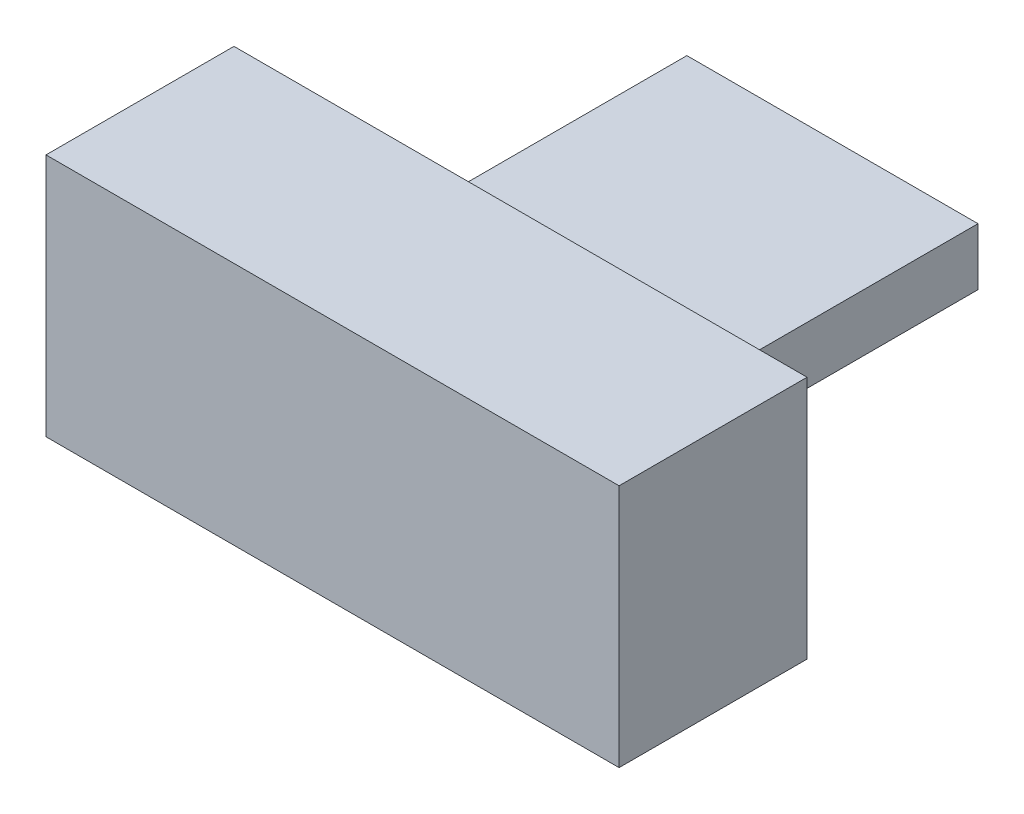
ISO-10303-21;
HEADER;
FILE_DESCRIPTION(('STEP AP214'),'2;1');
FILE_NAME('part.step','',(''),(''),'','','');
FILE_SCHEMA(('AUTOMOTIVE_DESIGN { 1 0 10303 214 1 1 1 1 }'));
ENDSEC;
DATA;
#1=APPLICATION_CONTEXT('core data for automotive mechanical design processes');
#2=APPLICATION_PROTOCOL_DEFINITION('international standard','automotive_design',2000,#1);
#3=PRODUCT_CONTEXT('',#1,'mechanical');
#4=PRODUCT('Part','Part','',(#3));
#5=PRODUCT_RELATED_PRODUCT_CATEGORY('part','',(#4));
#6=PRODUCT_DEFINITION_FORMATION('','',#4);
#7=PRODUCT_DEFINITION_CONTEXT('part definition',#1,'design');
#8=PRODUCT_DEFINITION('design','',#6,#7);
#9=PRODUCT_DEFINITION_SHAPE('','',#8);
#10=(LENGTH_UNIT() NAMED_UNIT(*) SI_UNIT(.MILLI.,.METRE.));
#11=(NAMED_UNIT(*) PLANE_ANGLE_UNIT() SI_UNIT($,.RADIAN.));
#12=(NAMED_UNIT(*) SI_UNIT($,.STERADIAN.) SOLID_ANGLE_UNIT());
#13=UNCERTAINTY_MEASURE_WITH_UNIT(LENGTH_MEASURE(1.E-05),#10,'distance_accuracy_value','');
#14=(GEOMETRIC_REPRESENTATION_CONTEXT(3) GLOBAL_UNCERTAINTY_ASSIGNED_CONTEXT((#13)) GLOBAL_UNIT_ASSIGNED_CONTEXT((#10,
#11,#12)) REPRESENTATION_CONTEXT('',''));
#15=CARTESIAN_POINT('',(0.,0.,0.));
#16=DIRECTION('',(0.,0.,1.));
#17=DIRECTION('',(1.,0.,0.));
#18=AXIS2_PLACEMENT_3D('',#15,#16,#17);
#19=CARTESIAN_POINT('',(-35.0012,14.9098,-11.4808));
#20=DIRECTION('',(0.,0.,1.));
#21=DIRECTION('',(1.,0.,0.));
#22=AXIS2_PLACEMENT_3D('',#19,#20,#21);
#23=PLANE('',#22);
#24=DIRECTION('',(-1.,0.,0.));
#25=VECTOR('',#24,1.);
#26=CARTESIAN_POINT('',(-35.0012,-14.9098,-11.4808));
#27=LINE('',#26,#25);
#28=CARTESIAN_POINT('',(35.0012,-14.9098,-11.4808));
#29=VERTEX_POINT('',#28);
#30=CARTESIAN_POINT('',(-35.0012,-14.9098,-11.4808));
#31=VERTEX_POINT('',#30);
#32=EDGE_CURVE('E132',#29,#31,#27,.T.);
#33=ORIENTED_EDGE('',*,*,#32,.T.);
#34=DIRECTION('',(0.,-1.,0.));
#35=VECTOR('',#34,1.);
#36=CARTESIAN_POINT('',(-35.0012,14.9098,-11.4808));
#37=LINE('',#36,#35);
#38=CARTESIAN_POINT('',(-35.0012,14.9098,-11.4808));
#39=VERTEX_POINT('',#38);
#40=EDGE_CURVE('E137',#39,#31,#37,.T.);
#41=ORIENTED_EDGE('',*,*,#40,.F.);
#42=DIRECTION('',(-1.,0.,0.));
#43=VECTOR('',#42,1.);
#44=CARTESIAN_POINT('',(-35.0012,14.9098,-11.4808));
#45=LINE('',#44,#43);
#46=CARTESIAN_POINT('',(35.0012,14.9098,-11.4808));
#47=VERTEX_POINT('',#46);
#48=EDGE_CURVE('E136',#47,#39,#45,.T.);
#49=ORIENTED_EDGE('',*,*,#48,.F.);
#50=DIRECTION('',(0.,-1.,0.));
#51=VECTOR('',#50,1.);
#52=CARTESIAN_POINT('',(35.0012,14.9098,-11.4808));
#53=LINE('',#52,#51);
#54=EDGE_CURVE('E145',#47,#29,#53,.T.);
#55=ORIENTED_EDGE('',*,*,#54,.T.);
#56=EDGE_LOOP('',(#33,#41,#49,#55));
#57=FACE_BOUND('',#56,.T.);
#58=DIRECTION('',(0.,-1.,0.));
#59=VECTOR('',#58,1.);
#60=CARTESIAN_POINT('',(17.78,-3.4925,-11.4808));
#61=LINE('',#60,#59);
#62=CARTESIAN_POINT('',(17.78,3.4925,-11.4808));
#63=VERTEX_POINT('',#62);
#64=CARTESIAN_POINT('',(17.78,-3.4925,-11.4808));
#65=VERTEX_POINT('',#64);
#66=EDGE_CURVE('E118',#63,#65,#61,.T.);
#67=ORIENTED_EDGE('',*,*,#66,.F.);
#68=DIRECTION('',(1.,0.,0.));
#69=VECTOR('',#68,1.);
#70=CARTESIAN_POINT('',(17.78,3.4925,-11.4808));
#71=LINE('',#70,#69);
#72=CARTESIAN_POINT('',(-17.78,3.4925,-11.4808));
#73=VERTEX_POINT('',#72);
#74=EDGE_CURVE('E115',#73,#63,#71,.T.);
#75=ORIENTED_EDGE('',*,*,#74,.F.);
#76=DIRECTION('',(0.,1.,0.));
#77=VECTOR('',#76,1.);
#78=CARTESIAN_POINT('',(-17.78,-3.4925,-11.4808));
#79=LINE('',#78,#77);
#80=CARTESIAN_POINT('',(-17.78,-3.4925,-11.4808));
#81=VERTEX_POINT('',#80);
#82=EDGE_CURVE('E53',#81,#73,#79,.T.);
#83=ORIENTED_EDGE('',*,*,#82,.F.);
#84=DIRECTION('',(-1.,0.,0.));
#85=VECTOR('',#84,1.);
#86=CARTESIAN_POINT('',(17.78,-3.4925,-11.4808));
#87=LINE('',#86,#85);
#88=EDGE_CURVE('E48',#65,#81,#87,.T.);
#89=ORIENTED_EDGE('',*,*,#88,.F.);
#90=EDGE_LOOP('',(#67,#75,#83,#89));
#91=FACE_BOUND('',#90,.T.);
#92=ADVANCED_FACE('F33',(#57,#91),#23,.F.);
#93=CARTESIAN_POINT('',(-35.0012,14.9098,-11.4808));
#94=DIRECTION('',(1.,0.,0.));
#95=DIRECTION('',(0.,0.,-1.));
#96=AXIS2_PLACEMENT_3D('',#93,#94,#95);
#97=PLANE('',#96);
#98=DIRECTION('',(0.,0.,1.));
#99=VECTOR('',#98,1.);
#100=CARTESIAN_POINT('',(-35.0012,-14.9098,-11.4808));
#101=LINE('',#100,#99);
#102=CARTESIAN_POINT('',(-35.0012,-14.9098,11.4808));
#103=VERTEX_POINT('',#102);
#104=EDGE_CURVE('E119',#31,#103,#101,.T.);
#105=ORIENTED_EDGE('',*,*,#104,.T.);
#106=DIRECTION('',(0.,-1.,0.));
#107=VECTOR('',#106,1.);
#108=CARTESIAN_POINT('',(-35.0012,14.9098,11.4808));
#109=LINE('',#108,#107);
#110=CARTESIAN_POINT('',(-35.0012,14.9098,11.4808));
#111=VERTEX_POINT('',#110);
#112=EDGE_CURVE('E11',#111,#103,#109,.T.);
#113=ORIENTED_EDGE('',*,*,#112,.F.);
#114=DIRECTION('',(0.,0.,1.));
#115=VECTOR('',#114,1.);
#116=CARTESIAN_POINT('',(-35.0012,14.9098,-11.4808));
#117=LINE('',#116,#115);
#118=EDGE_CURVE('E128',#39,#111,#117,.T.);
#119=ORIENTED_EDGE('',*,*,#118,.F.);
#120=ORIENTED_EDGE('',*,*,#40,.T.);
#121=EDGE_LOOP('',(#105,#113,#119,#120));
#122=FACE_BOUND('',#121,.T.);
#123=ADVANCED_FACE('F35',(#122),#97,.F.);
#124=CARTESIAN_POINT('',(-35.0012,14.9098,11.4808));
#125=DIRECTION('',(0.,0.,-1.));
#126=DIRECTION('',(-1.,0.,0.));
#127=AXIS2_PLACEMENT_3D('',#124,#125,#126);
#128=PLANE('',#127);
#129=DIRECTION('',(1.,0.,0.));
#130=VECTOR('',#129,1.);
#131=CARTESIAN_POINT('',(-35.0012,-14.9098,11.4808));
#132=LINE('',#131,#130);
#133=CARTESIAN_POINT('',(35.0012,-14.9098,11.4808));
#134=VERTEX_POINT('',#133);
#135=EDGE_CURVE('E122',#103,#134,#132,.T.);
#136=ORIENTED_EDGE('',*,*,#135,.T.);
#137=DIRECTION('',(0.,-1.,0.));
#138=VECTOR('',#137,1.);
#139=CARTESIAN_POINT('',(35.0012,14.9098,11.4808));
#140=LINE('',#139,#138);
#141=CARTESIAN_POINT('',(35.0012,14.9098,11.4808));
#142=VERTEX_POINT('',#141);
#143=EDGE_CURVE('E41',#142,#134,#140,.T.);
#144=ORIENTED_EDGE('',*,*,#143,.F.);
#145=DIRECTION('',(1.,0.,0.));
#146=VECTOR('',#145,1.);
#147=CARTESIAN_POINT('',(-35.0012,14.9098,11.4808));
#148=LINE('',#147,#146);
#149=EDGE_CURVE('E131',#111,#142,#148,.T.);
#150=ORIENTED_EDGE('',*,*,#149,.F.);
#151=ORIENTED_EDGE('',*,*,#112,.T.);
#152=EDGE_LOOP('',(#136,#144,#150,#151));
#153=FACE_BOUND('',#152,.T.);
#154=ADVANCED_FACE('F167',(#153),#128,.F.);
#155=CARTESIAN_POINT('',(35.0012,14.9098,-11.4808));
#156=DIRECTION('',(-1.,0.,0.));
#157=DIRECTION('',(0.,0.,1.));
#158=AXIS2_PLACEMENT_3D('',#155,#156,#157);
#159=PLANE('',#158);
#160=DIRECTION('',(0.,0.,-1.));
#161=VECTOR('',#160,1.);
#162=CARTESIAN_POINT('',(35.0012,-14.9098,-11.4808));
#163=LINE('',#162,#161);
#164=EDGE_CURVE('E140',#134,#29,#163,.T.);
#165=ORIENTED_EDGE('',*,*,#164,.T.);
#166=ORIENTED_EDGE('',*,*,#54,.F.);
#167=DIRECTION('',(0.,0.,-1.));
#168=VECTOR('',#167,1.);
#169=CARTESIAN_POINT('',(35.0012,14.9098,-11.4808));
#170=LINE('',#169,#168);
#171=EDGE_CURVE('E134',#142,#47,#170,.T.);
#172=ORIENTED_EDGE('',*,*,#171,.F.);
#173=ORIENTED_EDGE('',*,*,#143,.T.);
#174=EDGE_LOOP('',(#165,#166,#172,#173));
#175=FACE_BOUND('',#174,.T.);
#176=ADVANCED_FACE('F152',(#175),#159,.F.);
#177=CARTESIAN_POINT('',(0.,14.9098,0.));
#178=DIRECTION('',(0.,1.,0.));
#179=DIRECTION('',(0.,0.,1.));
#180=AXIS2_PLACEMENT_3D('',#177,#178,#179);
#181=PLANE('',#180);
#182=ORIENTED_EDGE('',*,*,#118,.T.);
#183=ORIENTED_EDGE('',*,*,#149,.T.);
#184=ORIENTED_EDGE('',*,*,#171,.T.);
#185=ORIENTED_EDGE('',*,*,#48,.T.);
#186=EDGE_LOOP('',(#182,#183,#184,#185));
#187=FACE_BOUND('',#186,.T.);
#188=ADVANCED_FACE('F166',(#187),#181,.T.);
#189=CARTESIAN_POINT('',(0.,-14.9098,0.));
#190=DIRECTION('',(0.,1.,0.));
#191=DIRECTION('',(0.,0.,1.));
#192=AXIS2_PLACEMENT_3D('',#189,#190,#191);
#193=PLANE('',#192);
#194=ORIENTED_EDGE('',*,*,#104,.F.);
#195=ORIENTED_EDGE('',*,*,#32,.F.);
#196=ORIENTED_EDGE('',*,*,#164,.F.);
#197=ORIENTED_EDGE('',*,*,#135,.F.);
#198=EDGE_LOOP('',(#194,#195,#196,#197));
#199=FACE_BOUND('',#198,.T.);
#200=ADVANCED_FACE('F158',(#199),#193,.F.);
#201=CARTESIAN_POINT('',(17.78,-3.4925,-49.5808));
#202=DIRECTION('',(-1.,0.,0.));
#203=DIRECTION('',(0.,0.,1.));
#204=AXIS2_PLACEMENT_3D('',#201,#202,#203);
#205=PLANE('',#204);
#206=ORIENTED_EDGE('',*,*,#66,.T.);
#207=DIRECTION('',(0.,0.,1.));
#208=VECTOR('',#207,1.);
#209=CARTESIAN_POINT('',(17.78,-3.4925,-49.5808));
#210=LINE('',#209,#208);
#211=CARTESIAN_POINT('',(17.78,-3.4925,-49.5808));
#212=VERTEX_POINT('',#211);
#213=EDGE_CURVE('E99',#212,#65,#210,.T.);
#214=ORIENTED_EDGE('',*,*,#213,.F.);
#215=DIRECTION('',(0.,-1.,0.));
#216=VECTOR('',#215,1.);
#217=CARTESIAN_POINT('',(17.78,-3.4925,-49.5808));
#218=LINE('',#217,#216);
#219=CARTESIAN_POINT('',(17.78,3.4925,-49.5808));
#220=VERTEX_POINT('',#219);
#221=EDGE_CURVE('E106',#220,#212,#218,.T.);
#222=ORIENTED_EDGE('',*,*,#221,.F.);
#223=DIRECTION('',(0.,0.,1.));
#224=VECTOR('',#223,1.);
#225=CARTESIAN_POINT('',(17.78,3.4925,-49.5808));
#226=LINE('',#225,#224);
#227=EDGE_CURVE('E260',#220,#63,#226,.T.);
#228=ORIENTED_EDGE('',*,*,#227,.T.);
#229=EDGE_LOOP('',(#206,#214,#222,#228));
#230=FACE_BOUND('',#229,.T.);
#231=ADVANCED_FACE('F117',(#230),#205,.F.);
#232=CARTESIAN_POINT('',(17.78,-3.4925,-49.5808));
#233=DIRECTION('',(0.,1.,0.));
#234=DIRECTION('',(0.,0.,1.));
#235=AXIS2_PLACEMENT_3D('',#232,#233,#234);
#236=PLANE('',#235);
#237=ORIENTED_EDGE('',*,*,#88,.T.);
#238=DIRECTION('',(0.,0.,1.));
#239=VECTOR('',#238,1.);
#240=CARTESIAN_POINT('',(-17.78,-3.4925,-49.5808));
#241=LINE('',#240,#239);
#242=CARTESIAN_POINT('',(-17.78,-3.4925,-49.5808));
#243=VERTEX_POINT('',#242);
#244=EDGE_CURVE('E102',#243,#81,#241,.T.);
#245=ORIENTED_EDGE('',*,*,#244,.F.);
#246=DIRECTION('',(-1.,0.,0.));
#247=VECTOR('',#246,1.);
#248=CARTESIAN_POINT('',(17.78,-3.4925,-49.5808));
#249=LINE('',#248,#247);
#250=EDGE_CURVE('E95',#212,#243,#249,.T.);
#251=ORIENTED_EDGE('',*,*,#250,.F.);
#252=ORIENTED_EDGE('',*,*,#213,.T.);
#253=EDGE_LOOP('',(#237,#245,#251,#252));
#254=FACE_BOUND('',#253,.T.);
#255=ADVANCED_FACE('F97',(#254),#236,.F.);
#256=CARTESIAN_POINT('',(-17.78,-3.4925,-49.5808));
#257=DIRECTION('',(1.,0.,0.));
#258=DIRECTION('',(0.,0.,-1.));
#259=AXIS2_PLACEMENT_3D('',#256,#257,#258);
#260=PLANE('',#259);
#261=ORIENTED_EDGE('',*,*,#82,.T.);
#262=DIRECTION('',(0.,0.,1.));
#263=VECTOR('',#262,1.);
#264=CARTESIAN_POINT('',(-17.78,3.4925,-49.5808));
#265=LINE('',#264,#263);
#266=CARTESIAN_POINT('',(-17.78,3.4925,-49.5808));
#267=VERTEX_POINT('',#266);
#268=EDGE_CURVE('E124',#267,#73,#265,.T.);
#269=ORIENTED_EDGE('',*,*,#268,.F.);
#270=DIRECTION('',(0.,1.,0.));
#271=VECTOR('',#270,1.);
#272=CARTESIAN_POINT('',(-17.78,-3.4925,-49.5808));
#273=LINE('',#272,#271);
#274=EDGE_CURVE('E105',#243,#267,#273,.T.);
#275=ORIENTED_EDGE('',*,*,#274,.F.);
#276=ORIENTED_EDGE('',*,*,#244,.T.);
#277=EDGE_LOOP('',(#261,#269,#275,#276));
#278=FACE_BOUND('',#277,.T.);
#279=ADVANCED_FACE('F187',(#278),#260,.F.);
#280=CARTESIAN_POINT('',(17.78,3.4925,-49.5808));
#281=DIRECTION('',(0.,-1.,0.));
#282=DIRECTION('',(0.,0.,-1.));
#283=AXIS2_PLACEMENT_3D('',#280,#281,#282);
#284=PLANE('',#283);
#285=ORIENTED_EDGE('',*,*,#74,.T.);
#286=ORIENTED_EDGE('',*,*,#227,.F.);
#287=DIRECTION('',(1.,0.,0.));
#288=VECTOR('',#287,1.);
#289=CARTESIAN_POINT('',(17.78,3.4925,-49.5808));
#290=LINE('',#289,#288);
#291=EDGE_CURVE('E111',#267,#220,#290,.T.);
#292=ORIENTED_EDGE('',*,*,#291,.F.);
#293=ORIENTED_EDGE('',*,*,#268,.T.);
#294=EDGE_LOOP('',(#285,#286,#292,#293));
#295=FACE_BOUND('',#294,.T.);
#296=ADVANCED_FACE('F190',(#295),#284,.F.);
#297=CARTESIAN_POINT('',(0.,0.,-49.5808));
#298=DIRECTION('',(0.,0.,1.));
#299=DIRECTION('',(1.,0.,0.));
#300=AXIS2_PLACEMENT_3D('',#297,#298,#299);
#301=PLANE('',#300);
#302=ORIENTED_EDGE('',*,*,#221,.T.);
#303=ORIENTED_EDGE('',*,*,#250,.T.);
#304=ORIENTED_EDGE('',*,*,#274,.T.);
#305=ORIENTED_EDGE('',*,*,#291,.T.);
#306=EDGE_LOOP('',(#302,#303,#304,#305));
#307=FACE_BOUND('',#306,.T.);
#308=ADVANCED_FACE('F109',(#307),#301,.F.);
#309=CLOSED_SHELL('',(#92,#123,#154,#176,#188,#200,#231,#255,#279,#296,#308));
#310=MANIFOLD_SOLID_BREP('B2',#309);
#311=ADVANCED_BREP_SHAPE_REPRESENTATION('',(#18,#310),#14);
#312=SHAPE_DEFINITION_REPRESENTATION(#9,#311);
ENDSEC;
END-ISO-10303-21;
